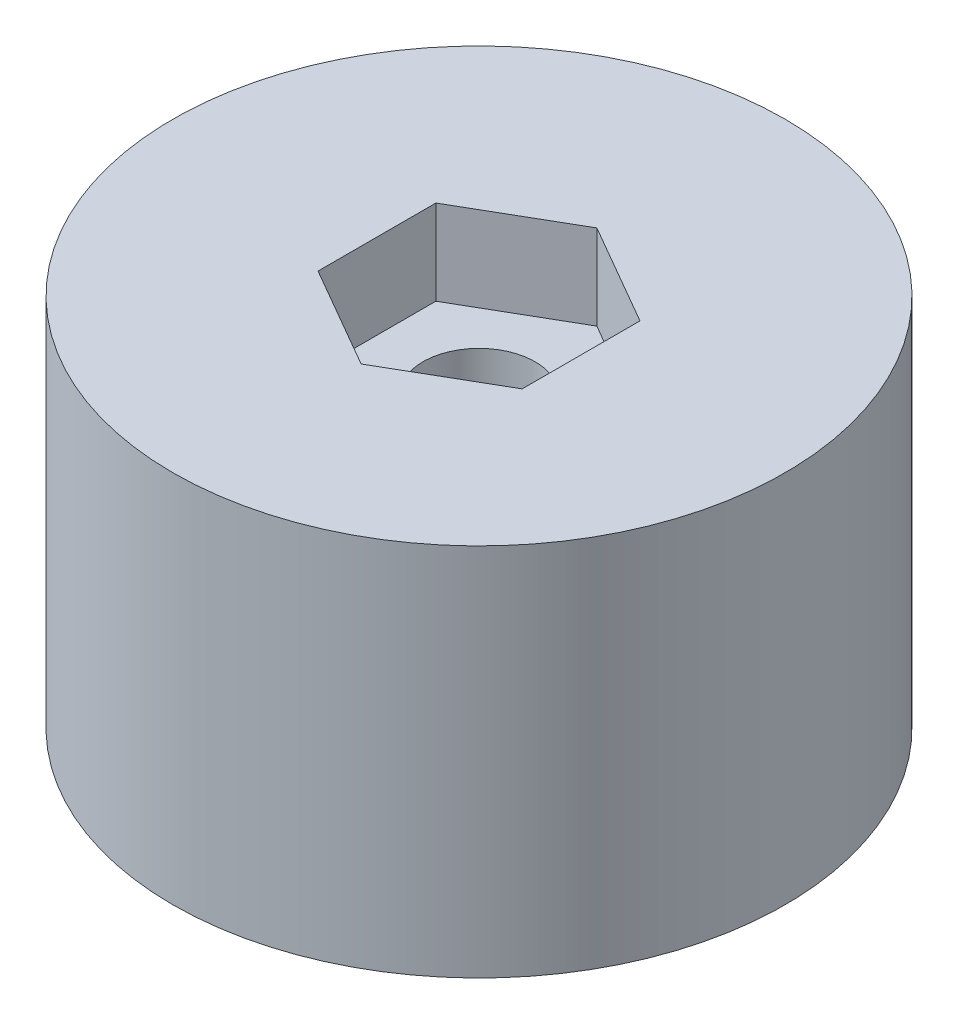
ISO-10303-21;
HEADER;
FILE_DESCRIPTION(('STEP AP214'),'2;1');
FILE_NAME('part.step','',(''),(''),'','','');
FILE_SCHEMA(('AUTOMOTIVE_DESIGN { 1 0 10303 214 1 1 1 1 }'));
ENDSEC;
DATA;
#1=APPLICATION_CONTEXT('core data for automotive mechanical design processes');
#2=APPLICATION_PROTOCOL_DEFINITION('international standard','automotive_design',2000,#1);
#3=PRODUCT_CONTEXT('',#1,'mechanical');
#4=PRODUCT('Part','Part','',(#3));
#5=PRODUCT_RELATED_PRODUCT_CATEGORY('part','',(#4));
#6=PRODUCT_DEFINITION_FORMATION('','',#4);
#7=PRODUCT_DEFINITION_CONTEXT('part definition',#1,'design');
#8=PRODUCT_DEFINITION('design','',#6,#7);
#9=PRODUCT_DEFINITION_SHAPE('','',#8);
#10=(LENGTH_UNIT() NAMED_UNIT(*) SI_UNIT(.MILLI.,.METRE.));
#11=(NAMED_UNIT(*) PLANE_ANGLE_UNIT() SI_UNIT($,.RADIAN.));
#12=(NAMED_UNIT(*) SI_UNIT($,.STERADIAN.) SOLID_ANGLE_UNIT());
#13=UNCERTAINTY_MEASURE_WITH_UNIT(LENGTH_MEASURE(1.E-05),#10,'distance_accuracy_value','');
#14=(GEOMETRIC_REPRESENTATION_CONTEXT(3) GLOBAL_UNCERTAINTY_ASSIGNED_CONTEXT((#13)) GLOBAL_UNIT_ASSIGNED_CONTEXT((#10,
#11,#12)) REPRESENTATION_CONTEXT('',''));
#15=CARTESIAN_POINT('',(0.,0.,0.));
#16=DIRECTION('',(0.,0.,1.));
#17=DIRECTION('',(1.,0.,0.));
#18=AXIS2_PLACEMENT_3D('',#15,#16,#17);
#19=CARTESIAN_POINT('',(0.,-0.000999999999999265,0.));
#20=DIRECTION('',(0.,1.,0.));
#21=DIRECTION('',(0.,0.,1.));
#22=AXIS2_PLACEMENT_3D('',#19,#20,#21);
#23=CYLINDRICAL_SURFACE('',#22,1.65);
#24=CARTESIAN_POINT('',(0.,0.,0.));
#25=DIRECTION('',(0.,1.,0.));
#26=DIRECTION('',(0.,0.,1.));
#27=AXIS2_PLACEMENT_3D('',#24,#25,#26);
#28=CIRCLE('',#27,1.65);
#29=CARTESIAN_POINT('',(0.,0.,1.65));
#30=VERTEX_POINT('',#29);
#31=EDGE_CURVE('E143',#30,#30,#28,.F.);
#32=ORIENTED_EDGE('',*,*,#31,.T.);
#33=EDGE_LOOP('',(#32));
#34=FACE_BOUND('',#33,.T.);
#35=CARTESIAN_POINT('',(0.,8.5,0.));
#36=DIRECTION('',(0.,1.,0.));
#37=DIRECTION('',(0.,0.,1.));
#38=AXIS2_PLACEMENT_3D('',#35,#36,#37);
#39=CIRCLE('',#38,1.65);
#40=CARTESIAN_POINT('',(0.,8.5,1.65));
#41=VERTEX_POINT('',#40);
#42=EDGE_CURVE('E37',#41,#41,#39,.F.);
#43=ORIENTED_EDGE('',*,*,#42,.F.);
#44=EDGE_LOOP('',(#43));
#45=FACE_BOUND('',#44,.T.);
#46=ADVANCED_FACE('F33',(#34,#45),#23,.F.);
#47=CARTESIAN_POINT('',(0.,11.,0.));
#48=DIRECTION('',(0.,-1.,0.));
#49=DIRECTION('',(0.,0.,-1.));
#50=AXIS2_PLACEMENT_3D('',#47,#48,#49);
#51=CYLINDRICAL_SURFACE('',#50,9.);
#52=CARTESIAN_POINT('',(0.,11.,0.));
#53=DIRECTION('',(0.,1.,0.));
#54=DIRECTION('',(0.,0.,1.));
#55=AXIS2_PLACEMENT_3D('',#52,#53,#54);
#56=CIRCLE('',#55,9.);
#57=CARTESIAN_POINT('',(0.,11.,9.));
#58=VERTEX_POINT('',#57);
#59=EDGE_CURVE('E11',#58,#58,#56,.T.);
#60=ORIENTED_EDGE('',*,*,#59,.F.);
#61=EDGE_LOOP('',(#60));
#62=FACE_BOUND('',#61,.T.);
#63=CARTESIAN_POINT('',(0.,0.,0.));
#64=DIRECTION('',(0.,1.,0.));
#65=DIRECTION('',(0.,0.,1.));
#66=AXIS2_PLACEMENT_3D('',#63,#64,#65);
#67=CIRCLE('',#66,9.);
#68=CARTESIAN_POINT('',(0.,0.,9.));
#69=VERTEX_POINT('',#68);
#70=EDGE_CURVE('E42',#69,#69,#67,.T.);
#71=ORIENTED_EDGE('',*,*,#70,.T.);
#72=EDGE_LOOP('',(#71));
#73=FACE_BOUND('',#72,.T.);
#74=ADVANCED_FACE('F35',(#62,#73),#51,.T.);
#75=CARTESIAN_POINT('',(0.,11.,0.));
#76=DIRECTION('',(0.,1.,0.));
#77=DIRECTION('',(0.,0.,1.));
#78=AXIS2_PLACEMENT_3D('',#75,#76,#77);
#79=PLANE('',#78);
#80=DIRECTION('',(0.866025403784439,0.,-0.5));
#81=VECTOR('',#80,1.);
#82=CARTESIAN_POINT('',(0.,11.,3.46410161513776));
#83=LINE('',#82,#81);
#84=CARTESIAN_POINT('',(0.,11.,3.46410161513776));
#85=VERTEX_POINT('',#84);
#86=CARTESIAN_POINT('',(3.,11.,1.73205080756888));
#87=VERTEX_POINT('',#86);
#88=EDGE_CURVE('E50',#85,#87,#83,.T.);
#89=ORIENTED_EDGE('',*,*,#88,.F.);
#90=DIRECTION('',(0.866025403784439,0.,0.5));
#91=VECTOR('',#90,1.);
#92=CARTESIAN_POINT('',(-3.,11.,1.73205080756888));
#93=LINE('',#92,#91);
#94=CARTESIAN_POINT('',(-3.,11.,1.73205080756888));
#95=VERTEX_POINT('',#94);
#96=EDGE_CURVE('E134',#95,#85,#93,.T.);
#97=ORIENTED_EDGE('',*,*,#96,.F.);
#98=DIRECTION('',(0.,0.,1.));
#99=VECTOR('',#98,1.);
#100=CARTESIAN_POINT('',(-3.,11.,-1.73205080756888));
#101=LINE('',#100,#99);
#102=CARTESIAN_POINT('',(-3.,11.,-1.73205080756888));
#103=VERTEX_POINT('',#102);
#104=EDGE_CURVE('E132',#103,#95,#101,.T.);
#105=ORIENTED_EDGE('',*,*,#104,.F.);
#106=DIRECTION('',(-0.866025403784439,0.,0.5));
#107=VECTOR('',#106,1.);
#108=CARTESIAN_POINT('',(0.,11.,-3.46410161513776));
#109=LINE('',#108,#107);
#110=CARTESIAN_POINT('',(0.,11.,-3.46410161513776));
#111=VERTEX_POINT('',#110);
#112=EDGE_CURVE('E98',#111,#103,#109,.T.);
#113=ORIENTED_EDGE('',*,*,#112,.F.);
#114=DIRECTION('',(-0.866025403784439,0.,-0.5));
#115=VECTOR('',#114,1.);
#116=CARTESIAN_POINT('',(3.,11.,-1.73205080756888));
#117=LINE('',#116,#115);
#118=CARTESIAN_POINT('',(3.,11.,-1.73205080756888));
#119=VERTEX_POINT('',#118);
#120=EDGE_CURVE('E128',#119,#111,#117,.T.);
#121=ORIENTED_EDGE('',*,*,#120,.F.);
#122=DIRECTION('',(0.,0.,-1.));
#123=VECTOR('',#122,1.);
#124=CARTESIAN_POINT('',(3.,11.,1.73205080756888));
#125=LINE('',#124,#123);
#126=EDGE_CURVE('E125',#87,#119,#125,.T.);
#127=ORIENTED_EDGE('',*,*,#126,.F.);
#128=EDGE_LOOP('',(#89,#97,#105,#113,#121,#127));
#129=FACE_BOUND('',#128,.T.);
#130=ORIENTED_EDGE('',*,*,#59,.T.);
#131=EDGE_LOOP('',(#130));
#132=FACE_BOUND('',#131,.T.);
#133=ADVANCED_FACE('F151',(#129,#132),#79,.T.);
#134=CARTESIAN_POINT('',(0.,0.,0.));
#135=DIRECTION('',(0.,1.,0.));
#136=DIRECTION('',(0.,0.,1.));
#137=AXIS2_PLACEMENT_3D('',#134,#135,#136);
#138=PLANE('',#137);
#139=ORIENTED_EDGE('',*,*,#31,.F.);
#140=EDGE_LOOP('',(#139));
#141=FACE_BOUND('',#140,.T.);
#142=ORIENTED_EDGE('',*,*,#70,.F.);
#143=EDGE_LOOP('',(#142));
#144=FACE_BOUND('',#143,.T.);
#145=ADVANCED_FACE('F149',(#141,#144),#138,.F.);
#146=CARTESIAN_POINT('',(0.,8.5,0.));
#147=DIRECTION('',(0.,1.,0.));
#148=DIRECTION('',(0.,0.,1.));
#149=AXIS2_PLACEMENT_3D('',#146,#147,#148);
#150=PLANE('',#149);
#151=DIRECTION('',(0.866025403784439,0.,-0.5));
#152=VECTOR('',#151,1.);
#153=CARTESIAN_POINT('',(0.,8.5,3.46410161513776));
#154=LINE('',#153,#152);
#155=CARTESIAN_POINT('',(0.,8.5,3.46410161513776));
#156=VERTEX_POINT('',#155);
#157=CARTESIAN_POINT('',(3.,8.5,1.73205080756888));
#158=VERTEX_POINT('',#157);
#159=EDGE_CURVE('E136',#156,#158,#154,.T.);
#160=ORIENTED_EDGE('',*,*,#159,.T.);
#161=DIRECTION('',(0.,0.,-1.));
#162=VECTOR('',#161,1.);
#163=CARTESIAN_POINT('',(3.,8.5,1.73205080756888));
#164=LINE('',#163,#162);
#165=CARTESIAN_POINT('',(3.,8.5,-1.73205080756888));
#166=VERTEX_POINT('',#165);
#167=EDGE_CURVE('E119',#158,#166,#164,.T.);
#168=ORIENTED_EDGE('',*,*,#167,.T.);
#169=DIRECTION('',(-0.866025403784439,0.,-0.5));
#170=VECTOR('',#169,1.);
#171=CARTESIAN_POINT('',(3.,8.5,-1.73205080756888));
#172=LINE('',#171,#170);
#173=CARTESIAN_POINT('',(0.,8.5,-3.46410161513776));
#174=VERTEX_POINT('',#173);
#175=EDGE_CURVE('E117',#166,#174,#172,.T.);
#176=ORIENTED_EDGE('',*,*,#175,.T.);
#177=DIRECTION('',(-0.866025403784439,0.,0.5));
#178=VECTOR('',#177,1.);
#179=CARTESIAN_POINT('',(0.,8.5,-3.46410161513776));
#180=LINE('',#179,#178);
#181=CARTESIAN_POINT('',(-3.,8.5,-1.73205080756888));
#182=VERTEX_POINT('',#181);
#183=EDGE_CURVE('E95',#174,#182,#180,.T.);
#184=ORIENTED_EDGE('',*,*,#183,.T.);
#185=DIRECTION('',(0.,0.,1.));
#186=VECTOR('',#185,1.);
#187=CARTESIAN_POINT('',(-3.,8.5,-1.73205080756888));
#188=LINE('',#187,#186);
#189=CARTESIAN_POINT('',(-3.,8.5,1.73205080756888));
#190=VERTEX_POINT('',#189);
#191=EDGE_CURVE('E106',#182,#190,#188,.T.);
#192=ORIENTED_EDGE('',*,*,#191,.T.);
#193=DIRECTION('',(0.866025403784439,0.,0.5));
#194=VECTOR('',#193,1.);
#195=CARTESIAN_POINT('',(-3.,8.5,1.73205080756888));
#196=LINE('',#195,#194);
#197=EDGE_CURVE('E110',#190,#156,#196,.T.);
#198=ORIENTED_EDGE('',*,*,#197,.T.);
#199=EDGE_LOOP('',(#160,#168,#176,#184,#192,#198));
#200=FACE_BOUND('',#199,.T.);
#201=ORIENTED_EDGE('',*,*,#42,.T.);
#202=EDGE_LOOP('',(#201));
#203=FACE_BOUND('',#202,.T.);
#204=ADVANCED_FACE('F113',(#200,#203),#150,.T.);
#205=CARTESIAN_POINT('',(0.,8.5,3.46410161513776));
#206=DIRECTION('',(0.5,0.,0.866025403784439));
#207=DIRECTION('',(0.866025403784439,0.,-0.5));
#208=AXIS2_PLACEMENT_3D('',#205,#206,#207);
#209=PLANE('',#208);
#210=ORIENTED_EDGE('',*,*,#88,.T.);
#211=DIRECTION('',(0.,1.,0.));
#212=VECTOR('',#211,1.);
#213=CARTESIAN_POINT('',(3.,8.5,1.73205080756888));
#214=LINE('',#213,#212);
#215=EDGE_CURVE('E80',#158,#87,#214,.T.);
#216=ORIENTED_EDGE('',*,*,#215,.F.);
#217=ORIENTED_EDGE('',*,*,#159,.F.);
#218=DIRECTION('',(0.,1.,0.));
#219=VECTOR('',#218,1.);
#220=CARTESIAN_POINT('',(0.,8.5,3.46410161513776));
#221=LINE('',#220,#219);
#222=EDGE_CURVE('E58',#156,#85,#221,.T.);
#223=ORIENTED_EDGE('',*,*,#222,.T.);
#224=EDGE_LOOP('',(#210,#216,#217,#223));
#225=FACE_BOUND('',#224,.T.);
#226=ADVANCED_FACE('F157',(#225),#209,.F.);
#227=CARTESIAN_POINT('',(-3.,8.5,1.73205080756888));
#228=DIRECTION('',(-0.5,0.,0.866025403784438));
#229=DIRECTION('',(0.866025403784438,0.,0.5));
#230=AXIS2_PLACEMENT_3D('',#227,#228,#229);
#231=PLANE('',#230);
#232=ORIENTED_EDGE('',*,*,#96,.T.);
#233=ORIENTED_EDGE('',*,*,#222,.F.);
#234=ORIENTED_EDGE('',*,*,#197,.F.);
#235=DIRECTION('',(0.,1.,0.));
#236=VECTOR('',#235,1.);
#237=CARTESIAN_POINT('',(-3.,8.5,1.73205080756888));
#238=LINE('',#237,#236);
#239=EDGE_CURVE('E102',#190,#95,#238,.T.);
#240=ORIENTED_EDGE('',*,*,#239,.T.);
#241=EDGE_LOOP('',(#232,#233,#234,#240));
#242=FACE_BOUND('',#241,.T.);
#243=ADVANCED_FACE('F173',(#242),#231,.F.);
#244=CARTESIAN_POINT('',(-3.,8.5,-1.73205080756888));
#245=DIRECTION('',(-1.,0.,0.));
#246=DIRECTION('',(0.,0.,1.));
#247=AXIS2_PLACEMENT_3D('',#244,#245,#246);
#248=PLANE('',#247);
#249=ORIENTED_EDGE('',*,*,#104,.T.);
#250=ORIENTED_EDGE('',*,*,#239,.F.);
#251=ORIENTED_EDGE('',*,*,#191,.F.);
#252=DIRECTION('',(0.,1.,0.));
#253=VECTOR('',#252,1.);
#254=CARTESIAN_POINT('',(-3.,8.5,-1.73205080756888));
#255=LINE('',#254,#253);
#256=EDGE_CURVE('E91',#182,#103,#255,.T.);
#257=ORIENTED_EDGE('',*,*,#256,.T.);
#258=EDGE_LOOP('',(#249,#250,#251,#257));
#259=FACE_BOUND('',#258,.T.);
#260=ADVANCED_FACE('F107',(#259),#248,.F.);
#261=CARTESIAN_POINT('',(0.,8.5,-3.46410161513776));
#262=DIRECTION('',(-0.5,0.,-0.866025403784439));
#263=DIRECTION('',(-0.866025403784439,0.,0.5));
#264=AXIS2_PLACEMENT_3D('',#261,#262,#263);
#265=PLANE('',#264);
#266=ORIENTED_EDGE('',*,*,#112,.T.);
#267=ORIENTED_EDGE('',*,*,#256,.F.);
#268=ORIENTED_EDGE('',*,*,#183,.F.);
#269=DIRECTION('',(0.,1.,0.));
#270=VECTOR('',#269,1.);
#271=CARTESIAN_POINT('',(0.,8.5,-3.46410161513776));
#272=LINE('',#271,#270);
#273=EDGE_CURVE('E103',#174,#111,#272,.T.);
#274=ORIENTED_EDGE('',*,*,#273,.T.);
#275=EDGE_LOOP('',(#266,#267,#268,#274));
#276=FACE_BOUND('',#275,.T.);
#277=ADVANCED_FACE('F93',(#276),#265,.F.);
#278=CARTESIAN_POINT('',(3.,8.5,-1.73205080756888));
#279=DIRECTION('',(0.5,0.,-0.866025403784439));
#280=DIRECTION('',(-0.866025403784439,0.,-0.5));
#281=AXIS2_PLACEMENT_3D('',#278,#279,#280);
#282=PLANE('',#281);
#283=ORIENTED_EDGE('',*,*,#120,.T.);
#284=ORIENTED_EDGE('',*,*,#273,.F.);
#285=ORIENTED_EDGE('',*,*,#175,.F.);
#286=DIRECTION('',(0.,1.,0.));
#287=VECTOR('',#286,1.);
#288=CARTESIAN_POINT('',(3.,8.5,-1.73205080756888));
#289=LINE('',#288,#287);
#290=EDGE_CURVE('E140',#166,#119,#289,.T.);
#291=ORIENTED_EDGE('',*,*,#290,.T.);
#292=EDGE_LOOP('',(#283,#284,#285,#291));
#293=FACE_BOUND('',#292,.T.);
#294=ADVANCED_FACE('F177',(#293),#282,.F.);
#295=CARTESIAN_POINT('',(3.,8.5,1.73205080756888));
#296=DIRECTION('',(1.,0.,0.));
#297=DIRECTION('',(0.,0.,-1.));
#298=AXIS2_PLACEMENT_3D('',#295,#296,#297);
#299=PLANE('',#298);
#300=ORIENTED_EDGE('',*,*,#126,.T.);
#301=ORIENTED_EDGE('',*,*,#290,.F.);
#302=ORIENTED_EDGE('',*,*,#167,.F.);
#303=ORIENTED_EDGE('',*,*,#215,.T.);
#304=EDGE_LOOP('',(#300,#301,#302,#303));
#305=FACE_BOUND('',#304,.T.);
#306=ADVANCED_FACE('F174',(#305),#299,.F.);
#307=CLOSED_SHELL('',(#46,#74,#133,#145,#204,#226,#243,#260,#277,#294,#306));
#308=MANIFOLD_SOLID_BREP('B2',#307);
#309=ADVANCED_BREP_SHAPE_REPRESENTATION('',(#18,#308),#14);
#310=SHAPE_DEFINITION_REPRESENTATION(#9,#309);
ENDSEC;
END-ISO-10303-21;
